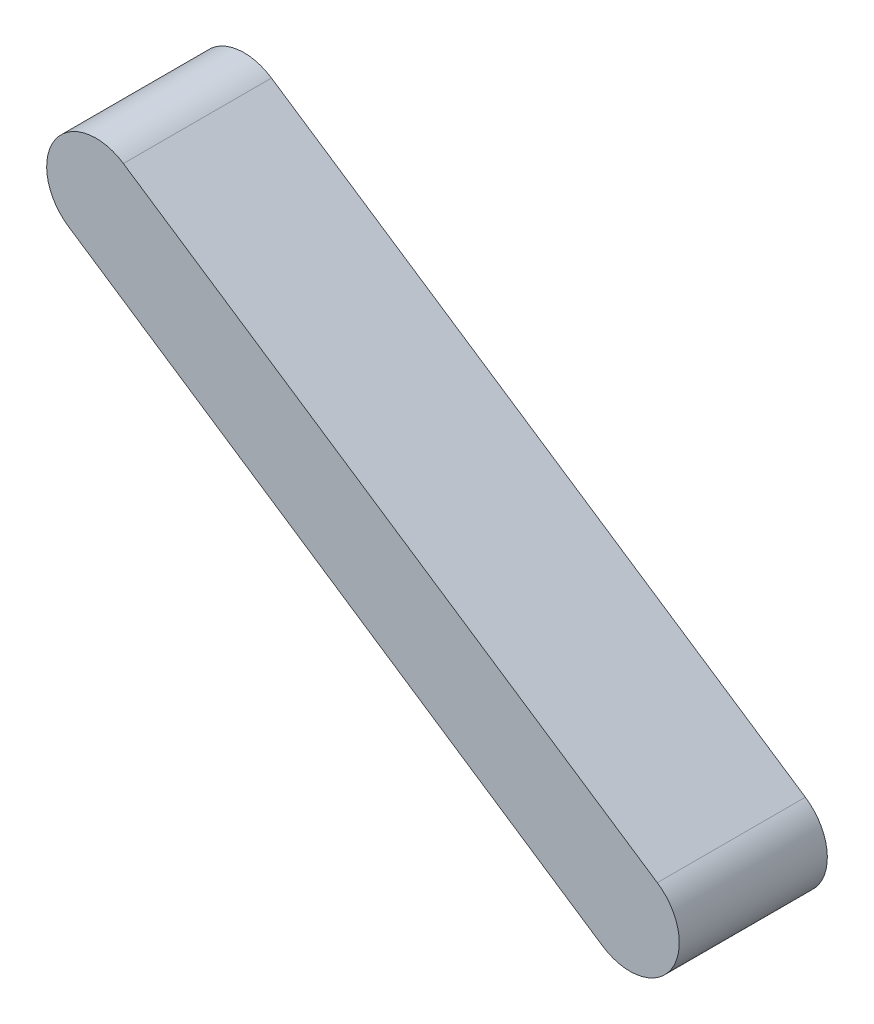
ISO-10303-21;
HEADER;
FILE_DESCRIPTION(('STEP AP214'),'2;1');
FILE_NAME('part.step','',(''),(''),'','','');
FILE_SCHEMA(('AUTOMOTIVE_DESIGN { 1 0 10303 214 1 1 1 1 }'));
ENDSEC;
DATA;
#1=APPLICATION_CONTEXT('core data for automotive mechanical design processes');
#2=APPLICATION_PROTOCOL_DEFINITION('international standard','automotive_design',2000,#1);
#3=PRODUCT_CONTEXT('',#1,'mechanical');
#4=PRODUCT('Part','Part','',(#3));
#5=PRODUCT_RELATED_PRODUCT_CATEGORY('part','',(#4));
#6=PRODUCT_DEFINITION_FORMATION('','',#4);
#7=PRODUCT_DEFINITION_CONTEXT('part definition',#1,'design');
#8=PRODUCT_DEFINITION('design','',#6,#7);
#9=PRODUCT_DEFINITION_SHAPE('','',#8);
#10=(LENGTH_UNIT() NAMED_UNIT(*) SI_UNIT(.MILLI.,.METRE.));
#11=(NAMED_UNIT(*) PLANE_ANGLE_UNIT() SI_UNIT($,.RADIAN.));
#12=(NAMED_UNIT(*) SI_UNIT($,.STERADIAN.) SOLID_ANGLE_UNIT());
#13=UNCERTAINTY_MEASURE_WITH_UNIT(LENGTH_MEASURE(1.E-05),#10,'distance_accuracy_value','');
#14=(GEOMETRIC_REPRESENTATION_CONTEXT(3) GLOBAL_UNCERTAINTY_ASSIGNED_CONTEXT((#13)) GLOBAL_UNIT_ASSIGNED_CONTEXT((#10,
#11,#12)) REPRESENTATION_CONTEXT('',''));
#15=CARTESIAN_POINT('',(0.,0.,0.));
#16=DIRECTION('',(0.,0.,1.));
#17=DIRECTION('',(1.,0.,0.));
#18=AXIS2_PLACEMENT_3D('',#15,#16,#17);
#19=CARTESIAN_POINT('',(0.,0.,15.));
#20=DIRECTION('',(0.,0.,-1.));
#21=DIRECTION('',(-1.,0.,0.));
#22=AXIS2_PLACEMENT_3D('',#19,#20,#21);
#23=CYLINDRICAL_SURFACE('',#22,10.);
#24=CARTESIAN_POINT('',(0.,0.,-15.));
#25=DIRECTION('',(0.,0.,1.));
#26=DIRECTION('',(1.,0.,0.));
#27=AXIS2_PLACEMENT_3D('',#24,#25,#26);
#28=CIRCLE('',#27,10.);
#29=CARTESIAN_POINT('',(-5.54634738523467,-8.32093929086739,-15.));
#30=VERTEX_POINT('',#29);
#31=CARTESIAN_POINT('',(5.54634738523467,8.32093929086739,-15.));
#32=VERTEX_POINT('',#31);
#33=EDGE_CURVE('E98',#30,#32,#28,.T.);
#34=ORIENTED_EDGE('',*,*,#33,.T.);
#35=DIRECTION('',(0.,0.,-1.));
#36=VECTOR('',#35,1.);
#37=CARTESIAN_POINT('',(5.54634738523467,8.32093929086739,15.));
#38=LINE('',#37,#36);
#39=CARTESIAN_POINT('',(5.54634738523467,8.32093929086739,15.));
#40=VERTEX_POINT('',#39);
#41=EDGE_CURVE('E11',#40,#32,#38,.T.);
#42=ORIENTED_EDGE('',*,*,#41,.F.);
#43=CARTESIAN_POINT('',(0.,0.,15.));
#44=DIRECTION('',(0.,0.,1.));
#45=DIRECTION('',(1.,0.,0.));
#46=AXIS2_PLACEMENT_3D('',#43,#44,#45);
#47=CIRCLE('',#46,10.);
#48=CARTESIAN_POINT('',(-5.54634738523467,-8.32093929086739,15.));
#49=VERTEX_POINT('',#48);
#50=EDGE_CURVE('E84',#49,#40,#47,.T.);
#51=ORIENTED_EDGE('',*,*,#50,.F.);
#52=DIRECTION('',(0.,0.,-1.));
#53=VECTOR('',#52,1.);
#54=CARTESIAN_POINT('',(-5.54634738523467,-8.32093929086739,15.));
#55=LINE('',#54,#53);
#56=EDGE_CURVE('E51',#49,#30,#55,.T.);
#57=ORIENTED_EDGE('',*,*,#56,.T.);
#58=EDGE_LOOP('',(#34,#42,#51,#57));
#59=FACE_BOUND('',#58,.T.);
#60=ADVANCED_FACE('F35',(#59),#23,.T.);
#61=CARTESIAN_POINT('',(5.54634738523467,8.32093929086739,15.));
#62=DIRECTION('',(-0.554634738523466,-0.832093929086738,0.));
#63=DIRECTION('',(0.832093929086739,-0.554634738523466,0.));
#64=AXIS2_PLACEMENT_3D('',#61,#62,#63);
#65=PLANE('',#64);
#66=DIRECTION('',(-0.832093929086738,0.554634738523466,0.));
#67=VECTOR('',#66,1.);
#68=CARTESIAN_POINT('',(5.54634738523467,8.32093929086739,-15.));
#69=LINE('',#68,#67);
#70=CARTESIAN_POINT('',(-102.625863396041,80.423455298918,-15.));
#71=VERTEX_POINT('',#70);
#72=EDGE_CURVE('E89',#32,#71,#69,.T.);
#73=ORIENTED_EDGE('',*,*,#72,.T.);
#74=DIRECTION('',(0.,0.,-1.));
#75=VECTOR('',#74,1.);
#76=CARTESIAN_POINT('',(-102.625863396041,80.423455298918,15.));
#77=LINE('',#76,#75);
#78=CARTESIAN_POINT('',(-102.625863396041,80.423455298918,15.));
#79=VERTEX_POINT('',#78);
#80=EDGE_CURVE('E43',#79,#71,#77,.T.);
#81=ORIENTED_EDGE('',*,*,#80,.F.);
#82=DIRECTION('',(-0.832093929086738,0.554634738523466,0.));
#83=VECTOR('',#82,1.);
#84=CARTESIAN_POINT('',(5.54634738523467,8.32093929086739,15.));
#85=LINE('',#84,#83);
#86=EDGE_CURVE('E77',#40,#79,#85,.T.);
#87=ORIENTED_EDGE('',*,*,#86,.F.);
#88=ORIENTED_EDGE('',*,*,#41,.T.);
#89=EDGE_LOOP('',(#73,#81,#87,#88));
#90=FACE_BOUND('',#89,.T.);
#91=ADVANCED_FACE('F88',(#90),#65,.F.);
#92=CARTESIAN_POINT('',(-108.172210781276,72.1025160080506,15.));
#93=DIRECTION('',(0.,0.,-1.));
#94=DIRECTION('',(-1.,0.,0.));
#95=AXIS2_PLACEMENT_3D('',#92,#93,#94);
#96=CYLINDRICAL_SURFACE('',#95,10.);
#97=CARTESIAN_POINT('',(-108.172210781276,72.1025160080506,-15.));
#98=DIRECTION('',(0.,0.,1.));
#99=DIRECTION('',(1.,0.,0.));
#100=AXIS2_PLACEMENT_3D('',#97,#98,#99);
#101=CIRCLE('',#100,10.);
#102=CARTESIAN_POINT('',(-113.718558166511,63.7815767171832,-15.));
#103=VERTEX_POINT('',#102);
#104=EDGE_CURVE('E101',#71,#103,#101,.T.);
#105=ORIENTED_EDGE('',*,*,#104,.T.);
#106=DIRECTION('',(0.,0.,-1.));
#107=VECTOR('',#106,1.);
#108=CARTESIAN_POINT('',(-113.718558166511,63.7815767171832,15.));
#109=LINE('',#108,#107);
#110=CARTESIAN_POINT('',(-113.718558166511,63.7815767171832,15.));
#111=VERTEX_POINT('',#110);
#112=EDGE_CURVE('E66',#111,#103,#109,.T.);
#113=ORIENTED_EDGE('',*,*,#112,.F.);
#114=CARTESIAN_POINT('',(-108.172210781276,72.1025160080506,15.));
#115=DIRECTION('',(0.,0.,1.));
#116=DIRECTION('',(1.,0.,0.));
#117=AXIS2_PLACEMENT_3D('',#114,#115,#116);
#118=CIRCLE('',#117,10.);
#119=EDGE_CURVE('E83',#79,#111,#118,.T.);
#120=ORIENTED_EDGE('',*,*,#119,.F.);
#121=ORIENTED_EDGE('',*,*,#80,.T.);
#122=EDGE_LOOP('',(#105,#113,#120,#121));
#123=FACE_BOUND('',#122,.T.);
#124=ADVANCED_FACE('F92',(#123),#96,.T.);
#125=CARTESIAN_POINT('',(-5.54634738523467,-8.32093929086739,15.));
#126=DIRECTION('',(-0.554634738523466,-0.832093929086738,0.));
#127=DIRECTION('',(0.832093929086739,-0.554634738523466,0.));
#128=AXIS2_PLACEMENT_3D('',#125,#126,#127);
#129=PLANE('',#128);
#130=DIRECTION('',(-0.832093929086738,0.554634738523466,0.));
#131=VECTOR('',#130,1.);
#132=CARTESIAN_POINT('',(-5.54634738523467,-8.32093929086739,-15.));
#133=LINE('',#132,#131);
#134=EDGE_CURVE('E103',#30,#103,#133,.T.);
#135=ORIENTED_EDGE('',*,*,#134,.F.);
#136=ORIENTED_EDGE('',*,*,#56,.F.);
#137=DIRECTION('',(-0.832093929086738,0.554634738523466,0.));
#138=VECTOR('',#137,1.);
#139=CARTESIAN_POINT('',(-5.54634738523467,-8.32093929086739,15.));
#140=LINE('',#139,#138);
#141=EDGE_CURVE('E93',#49,#111,#140,.T.);
#142=ORIENTED_EDGE('',*,*,#141,.T.);
#143=ORIENTED_EDGE('',*,*,#112,.T.);
#144=EDGE_LOOP('',(#135,#136,#142,#143));
#145=FACE_BOUND('',#144,.T.);
#146=ADVANCED_FACE('F109',(#145),#129,.T.);
#147=CARTESIAN_POINT('',(0.,0.,15.));
#148=DIRECTION('',(0.,0.,1.));
#149=DIRECTION('',(1.,0.,0.));
#150=AXIS2_PLACEMENT_3D('',#147,#148,#149);
#151=PLANE('',#150);
#152=ORIENTED_EDGE('',*,*,#50,.T.);
#153=ORIENTED_EDGE('',*,*,#86,.T.);
#154=ORIENTED_EDGE('',*,*,#119,.T.);
#155=ORIENTED_EDGE('',*,*,#141,.F.);
#156=EDGE_LOOP('',(#152,#153,#154,#155));
#157=FACE_BOUND('',#156,.T.);
#158=ADVANCED_FACE('F80',(#157),#151,.T.);
#159=CARTESIAN_POINT('',(0.,0.,-15.));
#160=DIRECTION('',(0.,0.,1.));
#161=DIRECTION('',(1.,0.,0.));
#162=AXIS2_PLACEMENT_3D('',#159,#160,#161);
#163=PLANE('',#162);
#164=ORIENTED_EDGE('',*,*,#33,.F.);
#165=ORIENTED_EDGE('',*,*,#134,.T.);
#166=ORIENTED_EDGE('',*,*,#104,.F.);
#167=ORIENTED_EDGE('',*,*,#72,.F.);
#168=EDGE_LOOP('',(#164,#165,#166,#167));
#169=FACE_BOUND('',#168,.T.);
#170=ADVANCED_FACE('F108',(#169),#163,.F.);
#171=CLOSED_SHELL('',(#60,#91,#124,#146,#158,#170));
#172=MANIFOLD_SOLID_BREP('B2',#171);
#173=ADVANCED_BREP_SHAPE_REPRESENTATION('',(#18,#172),#14);
#174=SHAPE_DEFINITION_REPRESENTATION(#9,#173);
ENDSEC;
END-ISO-10303-21;
